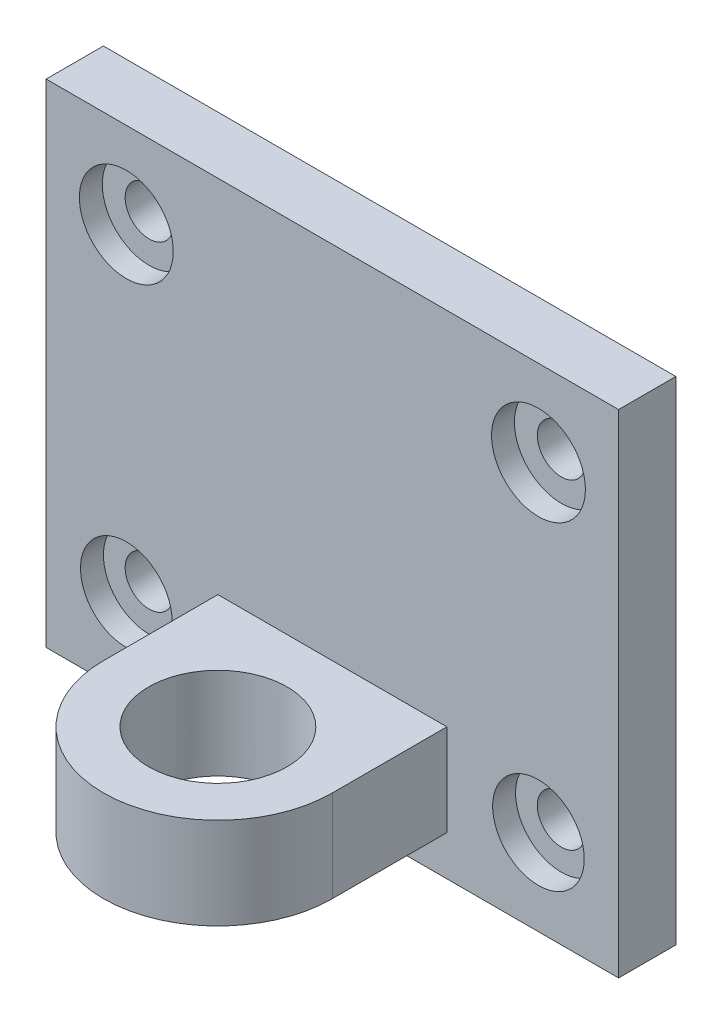
ISO-10303-21;
HEADER;
FILE_DESCRIPTION(('STEP AP214'),'2;1');
FILE_NAME('part.step','',(''),(''),'','','');
FILE_SCHEMA(('AUTOMOTIVE_DESIGN { 1 0 10303 214 1 1 1 1 }'));
ENDSEC;
DATA;
#1=APPLICATION_CONTEXT('core data for automotive mechanical design processes');
#2=APPLICATION_PROTOCOL_DEFINITION('international standard','automotive_design',2000,#1);
#3=PRODUCT_CONTEXT('',#1,'mechanical');
#4=PRODUCT('Part','Part','',(#3));
#5=PRODUCT_RELATED_PRODUCT_CATEGORY('part','',(#4));
#6=PRODUCT_DEFINITION_FORMATION('','',#4);
#7=PRODUCT_DEFINITION_CONTEXT('part definition',#1,'design');
#8=PRODUCT_DEFINITION('design','',#6,#7);
#9=PRODUCT_DEFINITION_SHAPE('','',#8);
#10=(LENGTH_UNIT() NAMED_UNIT(*) SI_UNIT(.MILLI.,.METRE.));
#11=(NAMED_UNIT(*) PLANE_ANGLE_UNIT() SI_UNIT($,.RADIAN.));
#12=(NAMED_UNIT(*) SI_UNIT($,.STERADIAN.) SOLID_ANGLE_UNIT());
#13=UNCERTAINTY_MEASURE_WITH_UNIT(LENGTH_MEASURE(1.E-05),#10,'distance_accuracy_value','');
#14=(GEOMETRIC_REPRESENTATION_CONTEXT(3) GLOBAL_UNCERTAINTY_ASSIGNED_CONTEXT((#13)) GLOBAL_UNIT_ASSIGNED_CONTEXT((#10,
#11,#12)) REPRESENTATION_CONTEXT('',''));
#15=CARTESIAN_POINT('',(0.,0.,0.));
#16=DIRECTION('',(0.,0.,1.));
#17=DIRECTION('',(1.,0.,0.));
#18=AXIS2_PLACEMENT_3D('',#15,#16,#17);
#19=CARTESIAN_POINT('',(-10.,26.5,12.));
#20=DIRECTION('',(0.,1.,0.));
#21=DIRECTION('',(0.,0.,1.));
#22=AXIS2_PLACEMENT_3D('',#19,#20,#21);
#23=PLANE('',#22);
#24=CARTESIAN_POINT('',(0.,26.5,2.00000000000001));
#25=DIRECTION('',(0.,1.,0.));
#26=DIRECTION('',(0.,0.,1.));
#27=AXIS2_PLACEMENT_3D('',#24,#25,#26);
#28=CIRCLE('',#27,6.05);
#29=CARTESIAN_POINT('',(0.,26.5,8.05));
#30=VERTEX_POINT('',#29);
#31=EDGE_CURVE('E347',#30,#30,#28,.T.);
#32=ORIENTED_EDGE('',*,*,#31,.F.);
#33=EDGE_LOOP('',(#32));
#34=FACE_BOUND('',#33,.T.);
#35=CARTESIAN_POINT('',(0.,26.5,2.00000000000001));
#36=DIRECTION('',(0.,1.,0.));
#37=DIRECTION('',(0.,0.,1.));
#38=AXIS2_PLACEMENT_3D('',#35,#36,#37);
#39=CIRCLE('',#38,10.);
#40=CARTESIAN_POINT('',(-10.,26.5,2.));
#41=VERTEX_POINT('',#40);
#42=CARTESIAN_POINT('',(10.,26.5,2.00000000000001));
#43=VERTEX_POINT('',#42);
#44=EDGE_CURVE('E245',#41,#43,#39,.T.);
#45=ORIENTED_EDGE('',*,*,#44,.T.);
#46=DIRECTION('',(0.,0.,-1.));
#47=VECTOR('',#46,1.);
#48=CARTESIAN_POINT('',(10.,26.5,12.));
#49=LINE('',#48,#47);
#50=CARTESIAN_POINT('',(10.,26.5,-8.));
#51=VERTEX_POINT('',#50);
#52=EDGE_CURVE('E248',#43,#51,#49,.T.);
#53=ORIENTED_EDGE('',*,*,#52,.T.);
#54=DIRECTION('',(1.,0.,0.));
#55=VECTOR('',#54,1.);
#56=CARTESIAN_POINT('',(-10.,26.5,-8.));
#57=LINE('',#56,#55);
#58=CARTESIAN_POINT('',(-10.,26.5,-8.));
#59=VERTEX_POINT('',#58);
#60=EDGE_CURVE('E342',#59,#51,#57,.T.);
#61=ORIENTED_EDGE('',*,*,#60,.F.);
#62=DIRECTION('',(0.,0.,-1.));
#63=VECTOR('',#62,1.);
#64=CARTESIAN_POINT('',(-10.,26.5,12.));
#65=LINE('',#64,#63);
#66=EDGE_CURVE('E249',#41,#59,#65,.T.);
#67=ORIENTED_EDGE('',*,*,#66,.F.);
#68=EDGE_LOOP('',(#45,#53,#61,#67));
#69=FACE_BOUND('',#68,.T.);
#70=ADVANCED_FACE('F179',(#34,#69),#23,.T.);
#71=CARTESIAN_POINT('',(10.,18.5,12.));
#72=DIRECTION('',(0.,-1.,0.));
#73=DIRECTION('',(0.,0.,-1.));
#74=AXIS2_PLACEMENT_3D('',#71,#72,#73);
#75=PLANE('',#74);
#76=CARTESIAN_POINT('',(0.,18.5,2.00000000000001));
#77=DIRECTION('',(0.,-1.,0.));
#78=DIRECTION('',(0.,0.,-1.));
#79=AXIS2_PLACEMENT_3D('',#76,#77,#78);
#80=CIRCLE('',#79,6.05);
#81=CARTESIAN_POINT('',(0.,18.5,-4.04999999999999));
#82=VERTEX_POINT('',#81);
#83=EDGE_CURVE('E340',#82,#82,#80,.T.);
#84=ORIENTED_EDGE('',*,*,#83,.F.);
#85=EDGE_LOOP('',(#84));
#86=FACE_BOUND('',#85,.T.);
#87=DIRECTION('',(0.,0.,-1.));
#88=VECTOR('',#87,1.);
#89=CARTESIAN_POINT('',(10.,18.5,12.));
#90=LINE('',#89,#88);
#91=CARTESIAN_POINT('',(10.,18.5,2.00000000000001));
#92=VERTEX_POINT('',#91);
#93=CARTESIAN_POINT('',(10.,18.5,-8.));
#94=VERTEX_POINT('',#93);
#95=EDGE_CURVE('E194',#92,#94,#90,.T.);
#96=ORIENTED_EDGE('',*,*,#95,.F.);
#97=CARTESIAN_POINT('',(0.,18.5,2.00000000000001));
#98=DIRECTION('',(0.,-1.,0.));
#99=DIRECTION('',(0.,0.,-1.));
#100=AXIS2_PLACEMENT_3D('',#97,#98,#99);
#101=CIRCLE('',#100,10.);
#102=CARTESIAN_POINT('',(-10.,18.5,2.));
#103=VERTEX_POINT('',#102);
#104=EDGE_CURVE('E256',#92,#103,#101,.T.);
#105=ORIENTED_EDGE('',*,*,#104,.T.);
#106=DIRECTION('',(0.,0.,-1.));
#107=VECTOR('',#106,1.);
#108=CARTESIAN_POINT('',(-10.,18.5,12.));
#109=LINE('',#108,#107);
#110=CARTESIAN_POINT('',(-10.,18.5,-8.));
#111=VERTEX_POINT('',#110);
#112=EDGE_CURVE('E264',#103,#111,#109,.T.);
#113=ORIENTED_EDGE('',*,*,#112,.T.);
#114=DIRECTION('',(-1.,0.,0.));
#115=VECTOR('',#114,1.);
#116=CARTESIAN_POINT('',(10.,18.5,-8.));
#117=LINE('',#116,#115);
#118=EDGE_CURVE('E357',#94,#111,#117,.T.);
#119=ORIENTED_EDGE('',*,*,#118,.F.);
#120=EDGE_LOOP('',(#96,#105,#113,#119));
#121=FACE_BOUND('',#120,.T.);
#122=ADVANCED_FACE('F361',(#86,#121),#75,.T.);
#123=CARTESIAN_POINT('',(0.,58.,-18.));
#124=DIRECTION('',(0.,-1.,0.));
#125=DIRECTION('',(0.,0.,-1.));
#126=AXIS2_PLACEMENT_3D('',#123,#124,#125);
#127=PLANE('',#126);
#128=DIRECTION('',(0.,0.,1.));
#129=VECTOR('',#128,1.);
#130=CARTESIAN_POINT('',(25.,58.,-18.));
#131=LINE('',#130,#129);
#132=CARTESIAN_POINT('',(25.,58.,-13.));
#133=VERTEX_POINT('',#132);
#134=CARTESIAN_POINT('',(25.,58.,-8.));
#135=VERTEX_POINT('',#134);
#136=EDGE_CURVE('E320',#133,#135,#131,.T.);
#137=ORIENTED_EDGE('',*,*,#136,.F.);
#138=DIRECTION('',(-1.,0.,0.));
#139=VECTOR('',#138,1.);
#140=CARTESIAN_POINT('',(25.,58.,-13.));
#141=LINE('',#140,#139);
#142=CARTESIAN_POINT('',(-25.,58.,-13.));
#143=VERTEX_POINT('',#142);
#144=EDGE_CURVE('E270',#133,#143,#141,.T.);
#145=ORIENTED_EDGE('',*,*,#144,.T.);
#146=DIRECTION('',(0.,0.,1.));
#147=VECTOR('',#146,1.);
#148=CARTESIAN_POINT('',(-25.,58.,-18.));
#149=LINE('',#148,#147);
#150=CARTESIAN_POINT('',(-25.,58.,-8.));
#151=VERTEX_POINT('',#150);
#152=EDGE_CURVE('E322',#143,#151,#149,.T.);
#153=ORIENTED_EDGE('',*,*,#152,.T.);
#154=DIRECTION('',(-1.,0.,0.));
#155=VECTOR('',#154,1.);
#156=CARTESIAN_POINT('',(-25.,58.,-8.));
#157=LINE('',#156,#155);
#158=EDGE_CURVE('E317',#135,#151,#157,.T.);
#159=ORIENTED_EDGE('',*,*,#158,.F.);
#160=EDGE_LOOP('',(#137,#145,#153,#159));
#161=FACE_BOUND('',#160,.T.);
#162=ADVANCED_FACE('F407',(#161),#127,.F.);
#163=CARTESIAN_POINT('',(-18.,50.5,-10.));
#164=DIRECTION('',(0.,0.,1.));
#165=DIRECTION('',(1.,0.,0.));
#166=AXIS2_PLACEMENT_3D('',#163,#164,#165);
#167=CYLINDRICAL_SURFACE('',#166,4.1);
#168=CARTESIAN_POINT('',(-18.,50.5,-10.));
#169=DIRECTION('',(0.,0.,1.));
#170=DIRECTION('',(1.,0.,0.));
#171=AXIS2_PLACEMENT_3D('',#168,#169,#170);
#172=CIRCLE('',#171,4.1);
#173=CARTESIAN_POINT('',(-13.9,50.5,-10.));
#174=VERTEX_POINT('',#173);
#175=EDGE_CURVE('E299',#174,#174,#172,.T.);
#176=CARTESIAN_POINT('',(-18.,50.5,-8.));
#177=DIRECTION('',(0.,0.,-1.));
#178=DIRECTION('',(-1.,0.,0.));
#179=AXIS2_PLACEMENT_3D('',#176,#177,#178);
#180=CIRCLE('',#179,4.1);
#181=CARTESIAN_POINT('',(-13.9,50.5,-7.99999999999999));
#182=VERTEX_POINT('',#181);
#183=EDGE_CURVE('E187',#182,#182,#180,.T.);
#184=CARTESIAN_POINT('',(-13.9,50.5,-10.));
#185=CARTESIAN_POINT('',(-13.9,50.5,-9.97916666666667));
#186=CARTESIAN_POINT('',(-13.9,50.5,-9.95833333333333));
#187=CARTESIAN_POINT('',(-13.9,50.5,-9.91666666666667));
#188=CARTESIAN_POINT('',(-13.9,50.5,-9.89583333333333));
#189=CARTESIAN_POINT('',(-13.9,50.5,-9.85416666666667));
#190=CARTESIAN_POINT('',(-13.9,50.5,-9.83333333333333));
#191=CARTESIAN_POINT('',(-13.9,50.5,-9.79166666666667));
#192=CARTESIAN_POINT('',(-13.9,50.5,-9.77083333333333));
#193=CARTESIAN_POINT('',(-13.9,50.5,-9.72916666666667));
#194=CARTESIAN_POINT('',(-13.9,50.5,-9.70833333333333));
#195=CARTESIAN_POINT('',(-13.9,50.5,-9.66666666666667));
#196=CARTESIAN_POINT('',(-13.9,50.5,-9.64583333333333));
#197=CARTESIAN_POINT('',(-13.9,50.5,-9.60416666666667));
#198=CARTESIAN_POINT('',(-13.9,50.5,-9.58333333333333));
#199=CARTESIAN_POINT('',(-13.9,50.5,-9.54166666666667));
#200=CARTESIAN_POINT('',(-13.9,50.5,-9.52083333333333));
#201=CARTESIAN_POINT('',(-13.9,50.5,-9.47916666666667));
#202=CARTESIAN_POINT('',(-13.9,50.5,-9.45833333333333));
#203=CARTESIAN_POINT('',(-13.9,50.5,-9.41666666666667));
#204=CARTESIAN_POINT('',(-13.9,50.5,-9.39583333333333));
#205=CARTESIAN_POINT('',(-13.9,50.5,-9.35416666666666));
#206=CARTESIAN_POINT('',(-13.9,50.5,-9.33333333333333));
#207=CARTESIAN_POINT('',(-13.9,50.5,-9.29166666666666));
#208=CARTESIAN_POINT('',(-13.9,50.5,-9.27083333333333));
#209=CARTESIAN_POINT('',(-13.9,50.5,-9.22916666666666));
#210=CARTESIAN_POINT('',(-13.9,50.5,-9.20833333333333));
#211=CARTESIAN_POINT('',(-13.9,50.5,-9.16666666666666));
#212=CARTESIAN_POINT('',(-13.9,50.5,-9.14583333333333));
#213=CARTESIAN_POINT('',(-13.9,50.5,-9.10416666666666));
#214=CARTESIAN_POINT('',(-13.9,50.5,-9.08333333333333));
#215=CARTESIAN_POINT('',(-13.9,50.5,-9.04166666666666));
#216=CARTESIAN_POINT('',(-13.9,50.5,-9.02083333333333));
#217=CARTESIAN_POINT('',(-13.9,50.5,-8.97916666666666));
#218=CARTESIAN_POINT('',(-13.9,50.5,-8.95833333333333));
#219=CARTESIAN_POINT('',(-13.9,50.5,-8.91666666666666));
#220=CARTESIAN_POINT('',(-13.9,50.5,-8.89583333333333));
#221=CARTESIAN_POINT('',(-13.9,50.5,-8.85416666666666));
#222=CARTESIAN_POINT('',(-13.9,50.5,-8.83333333333333));
#223=CARTESIAN_POINT('',(-13.9,50.5,-8.79166666666666));
#224=CARTESIAN_POINT('',(-13.9,50.5,-8.77083333333333));
#225=CARTESIAN_POINT('',(-13.9,50.5,-8.72916666666666));
#226=CARTESIAN_POINT('',(-13.9,50.5,-8.70833333333333));
#227=CARTESIAN_POINT('',(-13.9,50.5,-8.66666666666666));
#228=CARTESIAN_POINT('',(-13.9,50.5,-8.64583333333333));
#229=CARTESIAN_POINT('',(-13.9,50.5,-8.60416666666666));
#230=CARTESIAN_POINT('',(-13.9,50.5,-8.58333333333333));
#231=CARTESIAN_POINT('',(-13.9,50.5,-8.54166666666666));
#232=CARTESIAN_POINT('',(-13.9,50.5,-8.52083333333333));
#233=CARTESIAN_POINT('',(-13.9,50.5,-8.47916666666666));
#234=CARTESIAN_POINT('',(-13.9,50.5,-8.45833333333333));
#235=CARTESIAN_POINT('',(-13.9,50.5,-8.41666666666666));
#236=CARTESIAN_POINT('',(-13.9,50.5,-8.39583333333333));
#237=CARTESIAN_POINT('',(-13.9,50.5,-8.35416666666666));
#238=CARTESIAN_POINT('',(-13.9,50.5,-8.33333333333333));
#239=CARTESIAN_POINT('',(-13.9,50.5,-8.29166666666666));
#240=CARTESIAN_POINT('',(-13.9,50.5,-8.27083333333333));
#241=CARTESIAN_POINT('',(-13.9,50.5,-8.22916666666666));
#242=CARTESIAN_POINT('',(-13.9,50.5,-8.20833333333333));
#243=CARTESIAN_POINT('',(-13.9,50.5,-8.16666666666666));
#244=CARTESIAN_POINT('',(-13.9,50.5,-8.14583333333333));
#245=CARTESIAN_POINT('',(-13.9,50.5,-8.10416666666666));
#246=CARTESIAN_POINT('',(-13.9,50.5,-8.08333333333333));
#247=CARTESIAN_POINT('',(-13.9,50.5,-8.04166666666666));
#248=CARTESIAN_POINT('',(-13.9,50.5,-8.02083333333333));
#249=CARTESIAN_POINT('',(-13.9,50.5,-7.99999999999999));
#250=B_SPLINE_CURVE_WITH_KNOTS('',3,(#184,#185,#186,#187,#188,#189,#190,#191,#192,#193,#194,
#195,#196,#197,#198,#199,#200,#201,#202,#203,#204,#205,#206,#207,#208,#209,#210,#211,#212,#213,
#214,#215,#216,#217,#218,#219,#220,#221,#222,#223,#224,#225,#226,#227,#228,#229,#230,#231,#232,
#233,#234,#235,#236,#237,#238,#239,#240,#241,#242,#243,#244,#245,#246,#247,#248,#249),
.UNSPECIFIED.,.F.,.F.,(4,2,2,2,2,2,2,2,2,2,2,2,2,2,2,2,2,2,2,2,2,2,2,2,2,2,2,2,2,2,2,2,4),(0.,
0.0625000000000001,0.125,0.1875,0.25,0.3125,0.375,0.4375,0.5,0.5625,0.625000000000001,
0.687500000000001,0.750000000000001,0.812500000000001,0.875000000000001,0.937500000000001,1.,
1.0625,1.125,1.1875,1.25,1.3125,1.375,1.4375,1.5,1.5625,1.625,1.6875,1.75,1.8125,1.875,1.9375,
2.),.UNSPECIFIED.);
#251=EDGE_CURVE('BSEAM493',#174,#182,#250,.T.);
#252=ORIENTED_EDGE('',*,*,#175,.F.);
#253=ORIENTED_EDGE('',*,*,#183,.F.);
#254=ORIENTED_EDGE('',*,*,#251,.T.);
#255=ORIENTED_EDGE('',*,*,#251,.F.);
#256=EDGE_LOOP('',(#252,#254,#253,#255));
#257=FACE_BOUND('',#256,.T.);
#258=ADVANCED_FACE('F493',(#257),#167,.F.);
#259=CARTESIAN_POINT('',(18.,50.5,-10.));
#260=DIRECTION('',(0.,0.,1.));
#261=DIRECTION('',(1.,0.,0.));
#262=AXIS2_PLACEMENT_3D('',#259,#260,#261);
#263=CYLINDRICAL_SURFACE('',#262,4.1);
#264=CARTESIAN_POINT('',(18.,50.5,-10.));
#265=DIRECTION('',(0.,0.,1.));
#266=DIRECTION('',(1.,0.,0.));
#267=AXIS2_PLACEMENT_3D('',#264,#265,#266);
#268=CIRCLE('',#267,4.1);
#269=CARTESIAN_POINT('',(22.1,50.5,-10.));
#270=VERTEX_POINT('',#269);
#271=EDGE_CURVE('E303',#270,#270,#268,.T.);
#272=CARTESIAN_POINT('',(18.,50.5,-8.));
#273=DIRECTION('',(0.,0.,-1.));
#274=DIRECTION('',(-1.,0.,0.));
#275=AXIS2_PLACEMENT_3D('',#272,#273,#274);
#276=CIRCLE('',#275,4.1);
#277=CARTESIAN_POINT('',(22.1,50.5,-7.99999999999999));
#278=VERTEX_POINT('',#277);
#279=EDGE_CURVE('E328',#278,#278,#276,.T.);
#280=CARTESIAN_POINT('',(22.1,50.5,-10.));
#281=CARTESIAN_POINT('',(22.1,50.5,-9.97916666666667));
#282=CARTESIAN_POINT('',(22.1,50.5,-9.95833333333333));
#283=CARTESIAN_POINT('',(22.1,50.5,-9.91666666666667));
#284=CARTESIAN_POINT('',(22.1,50.5,-9.89583333333333));
#285=CARTESIAN_POINT('',(22.1,50.5,-9.85416666666667));
#286=CARTESIAN_POINT('',(22.1,50.5,-9.83333333333333));
#287=CARTESIAN_POINT('',(22.1,50.5,-9.79166666666667));
#288=CARTESIAN_POINT('',(22.1,50.5,-9.77083333333333));
#289=CARTESIAN_POINT('',(22.1,50.5,-9.72916666666667));
#290=CARTESIAN_POINT('',(22.1,50.5,-9.70833333333333));
#291=CARTESIAN_POINT('',(22.1,50.5,-9.66666666666667));
#292=CARTESIAN_POINT('',(22.1,50.5,-9.64583333333333));
#293=CARTESIAN_POINT('',(22.1,50.5,-9.60416666666667));
#294=CARTESIAN_POINT('',(22.1,50.5,-9.58333333333333));
#295=CARTESIAN_POINT('',(22.1,50.5,-9.54166666666667));
#296=CARTESIAN_POINT('',(22.1,50.5,-9.52083333333333));
#297=CARTESIAN_POINT('',(22.1,50.5,-9.47916666666667));
#298=CARTESIAN_POINT('',(22.1,50.5,-9.45833333333333));
#299=CARTESIAN_POINT('',(22.1,50.5,-9.41666666666667));
#300=CARTESIAN_POINT('',(22.1,50.5,-9.39583333333333));
#301=CARTESIAN_POINT('',(22.1,50.5,-9.35416666666666));
#302=CARTESIAN_POINT('',(22.1,50.5,-9.33333333333333));
#303=CARTESIAN_POINT('',(22.1,50.5,-9.29166666666666));
#304=CARTESIAN_POINT('',(22.1,50.5,-9.27083333333333));
#305=CARTESIAN_POINT('',(22.1,50.5,-9.22916666666666));
#306=CARTESIAN_POINT('',(22.1,50.5,-9.20833333333333));
#307=CARTESIAN_POINT('',(22.1,50.5,-9.16666666666666));
#308=CARTESIAN_POINT('',(22.1,50.5,-9.14583333333333));
#309=CARTESIAN_POINT('',(22.1,50.5,-9.10416666666666));
#310=CARTESIAN_POINT('',(22.1,50.5,-9.08333333333333));
#311=CARTESIAN_POINT('',(22.1,50.5,-9.04166666666666));
#312=CARTESIAN_POINT('',(22.1,50.5,-9.02083333333333));
#313=CARTESIAN_POINT('',(22.1,50.5,-8.97916666666666));
#314=CARTESIAN_POINT('',(22.1,50.5,-8.95833333333333));
#315=CARTESIAN_POINT('',(22.1,50.5,-8.91666666666666));
#316=CARTESIAN_POINT('',(22.1,50.5,-8.89583333333333));
#317=CARTESIAN_POINT('',(22.1,50.5,-8.85416666666666));
#318=CARTESIAN_POINT('',(22.1,50.5,-8.83333333333333));
#319=CARTESIAN_POINT('',(22.1,50.5,-8.79166666666666));
#320=CARTESIAN_POINT('',(22.1,50.5,-8.77083333333333));
#321=CARTESIAN_POINT('',(22.1,50.5,-8.72916666666666));
#322=CARTESIAN_POINT('',(22.1,50.5,-8.70833333333333));
#323=CARTESIAN_POINT('',(22.1,50.5,-8.66666666666666));
#324=CARTESIAN_POINT('',(22.1,50.5,-8.64583333333333));
#325=CARTESIAN_POINT('',(22.1,50.5,-8.60416666666666));
#326=CARTESIAN_POINT('',(22.1,50.5,-8.58333333333333));
#327=CARTESIAN_POINT('',(22.1,50.5,-8.54166666666666));
#328=CARTESIAN_POINT('',(22.1,50.5,-8.52083333333333));
#329=CARTESIAN_POINT('',(22.1,50.5,-8.47916666666666));
#330=CARTESIAN_POINT('',(22.1,50.5,-8.45833333333333));
#331=CARTESIAN_POINT('',(22.1,50.5,-8.41666666666666));
#332=CARTESIAN_POINT('',(22.1,50.5,-8.39583333333333));
#333=CARTESIAN_POINT('',(22.1,50.5,-8.35416666666666));
#334=CARTESIAN_POINT('',(22.1,50.5,-8.33333333333333));
#335=CARTESIAN_POINT('',(22.1,50.5,-8.29166666666666));
#336=CARTESIAN_POINT('',(22.1,50.5,-8.27083333333333));
#337=CARTESIAN_POINT('',(22.1,50.5,-8.22916666666666));
#338=CARTESIAN_POINT('',(22.1,50.5,-8.20833333333333));
#339=CARTESIAN_POINT('',(22.1,50.5,-8.16666666666666));
#340=CARTESIAN_POINT('',(22.1,50.5,-8.14583333333333));
#341=CARTESIAN_POINT('',(22.1,50.5,-8.10416666666666));
#342=CARTESIAN_POINT('',(22.1,50.5,-8.08333333333333));
#343=CARTESIAN_POINT('',(22.1,50.5,-8.04166666666666));
#344=CARTESIAN_POINT('',(22.1,50.5,-8.02083333333333));
#345=CARTESIAN_POINT('',(22.1,50.5,-7.99999999999999));
#346=B_SPLINE_CURVE_WITH_KNOTS('',3,(#280,#281,#282,#283,#284,#285,#286,#287,#288,#289,#290,
#291,#292,#293,#294,#295,#296,#297,#298,#299,#300,#301,#302,#303,#304,#305,#306,#307,#308,#309,
#310,#311,#312,#313,#314,#315,#316,#317,#318,#319,#320,#321,#322,#323,#324,#325,#326,#327,#328,
#329,#330,#331,#332,#333,#334,#335,#336,#337,#338,#339,#340,#341,#342,#343,#344,#345),
.UNSPECIFIED.,.F.,.F.,(4,2,2,2,2,2,2,2,2,2,2,2,2,2,2,2,2,2,2,2,2,2,2,2,2,2,2,2,2,2,2,2,4),(0.,
0.0625000000000001,0.125,0.1875,0.25,0.3125,0.375,0.4375,0.5,0.5625,0.625000000000001,
0.687500000000001,0.750000000000001,0.812500000000001,0.875000000000001,0.937500000000001,1.,
1.0625,1.125,1.1875,1.25,1.3125,1.375,1.4375,1.5,1.5625,1.625,1.6875,1.75,1.8125,1.875,1.9375,
2.),.UNSPECIFIED.);
#347=EDGE_CURVE('BSEAM483',#270,#278,#346,.T.);
#348=ORIENTED_EDGE('',*,*,#271,.F.);
#349=ORIENTED_EDGE('',*,*,#279,.F.);
#350=ORIENTED_EDGE('',*,*,#347,.T.);
#351=ORIENTED_EDGE('',*,*,#347,.F.);
#352=EDGE_LOOP('',(#348,#350,#349,#351));
#353=FACE_BOUND('',#352,.T.);
#354=ADVANCED_FACE('F483',(#353),#263,.F.);
#355=CARTESIAN_POINT('',(25.,58.,-18.));
#356=DIRECTION('',(-1.,0.,0.));
#357=DIRECTION('',(0.,-1.,0.));
#358=AXIS2_PLACEMENT_3D('',#355,#356,#357);
#359=PLANE('',#358);
#360=DIRECTION('',(0.,0.,1.));
#361=VECTOR('',#360,1.);
#362=CARTESIAN_POINT('',(25.,15.,-18.));
#363=LINE('',#362,#361);
#364=CARTESIAN_POINT('',(25.,15.,-13.));
#365=VERTEX_POINT('',#364);
#366=CARTESIAN_POINT('',(25.,15.,-8.));
#367=VERTEX_POINT('',#366);
#368=EDGE_CURVE('E326',#365,#367,#363,.T.);
#369=ORIENTED_EDGE('',*,*,#368,.F.);
#370=DIRECTION('',(0.,1.,0.));
#371=VECTOR('',#370,1.);
#372=CARTESIAN_POINT('',(25.,58.,-13.));
#373=LINE('',#372,#371);
#374=EDGE_CURVE('E202',#365,#133,#373,.T.);
#375=ORIENTED_EDGE('',*,*,#374,.T.);
#376=ORIENTED_EDGE('',*,*,#136,.T.);
#377=DIRECTION('',(0.,1.,0.));
#378=VECTOR('',#377,1.);
#379=CARTESIAN_POINT('',(25.,58.,-8.));
#380=LINE('',#379,#378);
#381=EDGE_CURVE('E314',#367,#135,#380,.T.);
#382=ORIENTED_EDGE('',*,*,#381,.F.);
#383=EDGE_LOOP('',(#369,#375,#376,#382));
#384=FACE_BOUND('',#383,.T.);
#385=ADVANCED_FACE('F475',(#384),#359,.F.);
#386=CARTESIAN_POINT('',(-25.,58.,-18.));
#387=DIRECTION('',(-1.,0.,0.));
#388=DIRECTION('',(0.,0.,1.));
#389=AXIS2_PLACEMENT_3D('',#386,#387,#388);
#390=PLANE('',#389);
#391=DIRECTION('',(0.,1.,0.));
#392=VECTOR('',#391,1.);
#393=CARTESIAN_POINT('',(-25.,58.,-13.));
#394=LINE('',#393,#392);
#395=CARTESIAN_POINT('',(-25.,15.,-13.));
#396=VERTEX_POINT('',#395);
#397=EDGE_CURVE('E261',#396,#143,#394,.T.);
#398=ORIENTED_EDGE('',*,*,#397,.F.);
#399=DIRECTION('',(0.,0.,1.));
#400=VECTOR('',#399,1.);
#401=CARTESIAN_POINT('',(-25.,15.,-18.));
#402=LINE('',#401,#400);
#403=CARTESIAN_POINT('',(-25.,15.,-8.));
#404=VERTEX_POINT('',#403);
#405=EDGE_CURVE('E324',#396,#404,#402,.T.);
#406=ORIENTED_EDGE('',*,*,#405,.T.);
#407=DIRECTION('',(0.,-1.,0.));
#408=VECTOR('',#407,1.);
#409=CARTESIAN_POINT('',(-25.,15.,-8.));
#410=LINE('',#409,#408);
#411=EDGE_CURVE('E307',#151,#404,#410,.T.);
#412=ORIENTED_EDGE('',*,*,#411,.F.);
#413=ORIENTED_EDGE('',*,*,#152,.F.);
#414=EDGE_LOOP('',(#398,#406,#412,#413));
#415=FACE_BOUND('',#414,.T.);
#416=ADVANCED_FACE('F470',(#415),#390,.T.);
#417=CARTESIAN_POINT('',(-18.,22.5,82.));
#418=DIRECTION('',(0.,0.,-1.));
#419=DIRECTION('',(-1.,0.,0.));
#420=AXIS2_PLACEMENT_3D('',#417,#418,#419);
#421=CYLINDRICAL_SURFACE('',#420,2.1);
#422=CARTESIAN_POINT('',(-18.,22.5,-13.));
#423=DIRECTION('',(0.,0.,1.));
#424=DIRECTION('',(0.,-1.,0.));
#425=AXIS2_PLACEMENT_3D('',#422,#423,#424);
#426=CIRCLE('',#425,2.1);
#427=CARTESIAN_POINT('',(-18.,20.4,-13.));
#428=VERTEX_POINT('',#427);
#429=EDGE_CURVE('E283',#428,#428,#426,.F.);
#430=ORIENTED_EDGE('',*,*,#429,.T.);
#431=EDGE_LOOP('',(#430));
#432=FACE_BOUND('',#431,.T.);
#433=CARTESIAN_POINT('',(-18.,22.5,-9.99999999999999));
#434=DIRECTION('',(0.,0.,1.));
#435=DIRECTION('',(1.,0.,0.));
#436=AXIS2_PLACEMENT_3D('',#433,#434,#435);
#437=CIRCLE('',#436,2.1);
#438=CARTESIAN_POINT('',(-15.9,22.5,-9.99999999999999));
#439=VERTEX_POINT('',#438);
#440=EDGE_CURVE('E306',#439,#439,#437,.F.);
#441=ORIENTED_EDGE('',*,*,#440,.F.);
#442=EDGE_LOOP('',(#441));
#443=FACE_BOUND('',#442,.T.);
#444=ADVANCED_FACE('F474',(#432,#443),#421,.F.);
#445=CARTESIAN_POINT('',(18.,22.5,82.));
#446=DIRECTION('',(0.,0.,-1.));
#447=DIRECTION('',(-1.,0.,0.));
#448=AXIS2_PLACEMENT_3D('',#445,#446,#447);
#449=CYLINDRICAL_SURFACE('',#448,2.1);
#450=CARTESIAN_POINT('',(18.,22.5,-13.));
#451=DIRECTION('',(0.,0.,1.));
#452=DIRECTION('',(0.,-1.,0.));
#453=AXIS2_PLACEMENT_3D('',#450,#451,#452);
#454=CIRCLE('',#453,2.1);
#455=CARTESIAN_POINT('',(18.,20.4,-13.));
#456=VERTEX_POINT('',#455);
#457=EDGE_CURVE('E280',#456,#456,#454,.F.);
#458=ORIENTED_EDGE('',*,*,#457,.T.);
#459=EDGE_LOOP('',(#458));
#460=FACE_BOUND('',#459,.T.);
#461=CARTESIAN_POINT('',(18.,22.5,-9.99999999999999));
#462=DIRECTION('',(0.,0.,1.));
#463=DIRECTION('',(1.,0.,0.));
#464=AXIS2_PLACEMENT_3D('',#461,#462,#463);
#465=CIRCLE('',#464,2.1);
#466=CARTESIAN_POINT('',(20.1,22.5,-9.99999999999999));
#467=VERTEX_POINT('',#466);
#468=EDGE_CURVE('E290',#467,#467,#465,.F.);
#469=ORIENTED_EDGE('',*,*,#468,.F.);
#470=EDGE_LOOP('',(#469));
#471=FACE_BOUND('',#470,.T.);
#472=ADVANCED_FACE('F369',(#460,#471),#449,.F.);
#473=CARTESIAN_POINT('',(-20.,51.5,-8.));
#474=DIRECTION('',(0.,0.,-1.));
#475=DIRECTION('',(-1.,0.,0.));
#476=AXIS2_PLACEMENT_3D('',#473,#474,#475);
#477=PLANE('',#476);
#478=DIRECTION('',(0.,-1.,0.));
#479=VECTOR('',#478,1.);
#480=CARTESIAN_POINT('',(-10.,22.5,-8.));
#481=LINE('',#480,#479);
#482=EDGE_CURVE('E345',#59,#111,#481,.T.);
#483=ORIENTED_EDGE('',*,*,#482,.F.);
#484=ORIENTED_EDGE('',*,*,#60,.T.);
#485=DIRECTION('',(0.,-1.,0.));
#486=VECTOR('',#485,1.);
#487=CARTESIAN_POINT('',(10.,22.5,-8.));
#488=LINE('',#487,#486);
#489=EDGE_CURVE('E259',#51,#94,#488,.T.);
#490=ORIENTED_EDGE('',*,*,#489,.T.);
#491=ORIENTED_EDGE('',*,*,#118,.T.);
#492=EDGE_LOOP('',(#483,#484,#490,#491));
#493=FACE_BOUND('',#492,.T.);
#494=ORIENTED_EDGE('',*,*,#183,.T.);
#495=EDGE_LOOP('',(#494));
#496=FACE_BOUND('',#495,.T.);
#497=ORIENTED_EDGE('',*,*,#279,.T.);
#498=EDGE_LOOP('',(#497));
#499=FACE_BOUND('',#498,.T.);
#500=ORIENTED_EDGE('',*,*,#381,.T.);
#501=ORIENTED_EDGE('',*,*,#158,.T.);
#502=ORIENTED_EDGE('',*,*,#411,.T.);
#503=DIRECTION('',(1.,0.,0.));
#504=VECTOR('',#503,1.);
#505=CARTESIAN_POINT('',(25.,15.,-8.));
#506=LINE('',#505,#504);
#507=EDGE_CURVE('E310',#404,#367,#506,.T.);
#508=ORIENTED_EDGE('',*,*,#507,.T.);
#509=EDGE_LOOP('',(#500,#501,#502,#508));
#510=FACE_BOUND('',#509,.T.);
#511=CARTESIAN_POINT('',(18.,22.5,-8.));
#512=DIRECTION('',(0.,0.,1.));
#513=DIRECTION('',(1.,0.,0.));
#514=AXIS2_PLACEMENT_3D('',#511,#512,#513);
#515=CIRCLE('',#514,4.);
#516=CARTESIAN_POINT('',(22.,22.5,-8.));
#517=VERTEX_POINT('',#516);
#518=EDGE_CURVE('E286',#517,#517,#515,.T.);
#519=ORIENTED_EDGE('',*,*,#518,.F.);
#520=EDGE_LOOP('',(#519));
#521=FACE_BOUND('',#520,.T.);
#522=CARTESIAN_POINT('',(-18.,22.5,-8.));
#523=DIRECTION('',(0.,0.,1.));
#524=DIRECTION('',(1.,0.,0.));
#525=AXIS2_PLACEMENT_3D('',#522,#523,#524);
#526=CIRCLE('',#525,4.);
#527=CARTESIAN_POINT('',(-14.,22.5,-8.));
#528=VERTEX_POINT('',#527);
#529=EDGE_CURVE('E291',#528,#528,#526,.T.);
#530=ORIENTED_EDGE('',*,*,#529,.F.);
#531=EDGE_LOOP('',(#530));
#532=FACE_BOUND('',#531,.T.);
#533=ADVANCED_FACE('F181',(#493,#496,#499,#510,#521,#532),#477,.F.);
#534=CARTESIAN_POINT('',(18.,50.5,82.));
#535=DIRECTION('',(0.,0.,-1.));
#536=DIRECTION('',(-1.,0.,0.));
#537=AXIS2_PLACEMENT_3D('',#534,#535,#536);
#538=CYLINDRICAL_SURFACE('',#537,2.1);
#539=CARTESIAN_POINT('',(18.,50.5,-13.));
#540=DIRECTION('',(0.,0.,1.));
#541=DIRECTION('',(0.,-1.,0.));
#542=AXIS2_PLACEMENT_3D('',#539,#540,#541);
#543=CIRCLE('',#542,2.1);
#544=CARTESIAN_POINT('',(18.,48.4,-13.));
#545=VERTEX_POINT('',#544);
#546=EDGE_CURVE('E277',#545,#545,#543,.F.);
#547=ORIENTED_EDGE('',*,*,#546,.T.);
#548=EDGE_LOOP('',(#547));
#549=FACE_BOUND('',#548,.T.);
#550=CARTESIAN_POINT('',(18.,50.5,-9.99999999999999));
#551=DIRECTION('',(0.,0.,1.));
#552=DIRECTION('',(1.,0.,0.));
#553=AXIS2_PLACEMENT_3D('',#550,#551,#552);
#554=CIRCLE('',#553,2.1);
#555=CARTESIAN_POINT('',(20.1,50.5,-9.99999999999999));
#556=VERTEX_POINT('',#555);
#557=EDGE_CURVE('E311',#556,#556,#554,.F.);
#558=ORIENTED_EDGE('',*,*,#557,.F.);
#559=EDGE_LOOP('',(#558));
#560=FACE_BOUND('',#559,.T.);
#561=ADVANCED_FACE('F368',(#549,#560),#538,.F.);
#562=CARTESIAN_POINT('',(-18.,50.5,82.));
#563=DIRECTION('',(0.,0.,-1.));
#564=DIRECTION('',(-1.,0.,0.));
#565=AXIS2_PLACEMENT_3D('',#562,#563,#564);
#566=CYLINDRICAL_SURFACE('',#565,2.1);
#567=CARTESIAN_POINT('',(-18.,50.5,-13.));
#568=DIRECTION('',(0.,0.,1.));
#569=DIRECTION('',(0.,-1.,0.));
#570=AXIS2_PLACEMENT_3D('',#567,#568,#569);
#571=CIRCLE('',#570,2.1);
#572=CARTESIAN_POINT('',(-18.,48.4,-13.));
#573=VERTEX_POINT('',#572);
#574=EDGE_CURVE('E273',#573,#573,#571,.F.);
#575=ORIENTED_EDGE('',*,*,#574,.T.);
#576=EDGE_LOOP('',(#575));
#577=FACE_BOUND('',#576,.T.);
#578=CARTESIAN_POINT('',(-18.,50.5,-9.99999999999999));
#579=DIRECTION('',(0.,0.,1.));
#580=DIRECTION('',(1.,0.,0.));
#581=AXIS2_PLACEMENT_3D('',#578,#579,#580);
#582=CIRCLE('',#581,2.1);
#583=CARTESIAN_POINT('',(-15.9,50.5,-9.99999999999999));
#584=VERTEX_POINT('',#583);
#585=EDGE_CURVE('E302',#584,#584,#582,.F.);
#586=ORIENTED_EDGE('',*,*,#585,.F.);
#587=EDGE_LOOP('',(#586));
#588=FACE_BOUND('',#587,.T.);
#589=ADVANCED_FACE('F569',(#577,#588),#566,.F.);
#590=CARTESIAN_POINT('',(25.,15.,-18.));
#591=DIRECTION('',(0.,1.,0.));
#592=DIRECTION('',(0.,0.,1.));
#593=AXIS2_PLACEMENT_3D('',#590,#591,#592);
#594=PLANE('',#593);
#595=ORIENTED_EDGE('',*,*,#405,.F.);
#596=DIRECTION('',(-1.,0.,0.));
#597=VECTOR('',#596,1.);
#598=CARTESIAN_POINT('',(25.,15.,-13.));
#599=LINE('',#598,#597);
#600=EDGE_CURVE('E268',#365,#396,#599,.T.);
#601=ORIENTED_EDGE('',*,*,#600,.F.);
#602=ORIENTED_EDGE('',*,*,#368,.T.);
#603=ORIENTED_EDGE('',*,*,#507,.F.);
#604=EDGE_LOOP('',(#595,#601,#602,#603));
#605=FACE_BOUND('',#604,.T.);
#606=ADVANCED_FACE('F561',(#605),#594,.F.);
#607=CARTESIAN_POINT('',(-18.,50.5,-10.));
#608=DIRECTION('',(0.,0.,1.));
#609=DIRECTION('',(1.,0.,0.));
#610=AXIS2_PLACEMENT_3D('',#607,#608,#609);
#611=PLANE('',#610);
#612=ORIENTED_EDGE('',*,*,#175,.T.);
#613=EDGE_LOOP('',(#612));
#614=FACE_BOUND('',#613,.T.);
#615=ORIENTED_EDGE('',*,*,#585,.T.);
#616=EDGE_LOOP('',(#615));
#617=FACE_BOUND('',#616,.T.);
#618=ADVANCED_FACE('F553',(#614,#617),#611,.T.);
#619=CARTESIAN_POINT('',(18.,50.5,-10.));
#620=DIRECTION('',(0.,0.,1.));
#621=DIRECTION('',(1.,0.,0.));
#622=AXIS2_PLACEMENT_3D('',#619,#620,#621);
#623=PLANE('',#622);
#624=ORIENTED_EDGE('',*,*,#271,.T.);
#625=EDGE_LOOP('',(#624));
#626=FACE_BOUND('',#625,.T.);
#627=ORIENTED_EDGE('',*,*,#557,.T.);
#628=EDGE_LOOP('',(#627));
#629=FACE_BOUND('',#628,.T.);
#630=ADVANCED_FACE('F547',(#626,#629),#623,.T.);
#631=CARTESIAN_POINT('',(18.,22.5,-10.));
#632=DIRECTION('',(0.,0.,1.));
#633=DIRECTION('',(1.,0.,0.));
#634=AXIS2_PLACEMENT_3D('',#631,#632,#633);
#635=PLANE('',#634);
#636=CARTESIAN_POINT('',(18.,22.5,-10.));
#637=DIRECTION('',(0.,0.,1.));
#638=DIRECTION('',(1.,0.,0.));
#639=AXIS2_PLACEMENT_3D('',#636,#637,#638);
#640=CIRCLE('',#639,4.);
#641=CARTESIAN_POINT('',(22.,22.5,-10.));
#642=VERTEX_POINT('',#641);
#643=EDGE_CURVE('E294',#642,#642,#640,.T.);
#644=ORIENTED_EDGE('',*,*,#643,.T.);
#645=EDGE_LOOP('',(#644));
#646=FACE_BOUND('',#645,.T.);
#647=ORIENTED_EDGE('',*,*,#468,.T.);
#648=EDGE_LOOP('',(#647));
#649=FACE_BOUND('',#648,.T.);
#650=ADVANCED_FACE('F538',(#646,#649),#635,.T.);
#651=CARTESIAN_POINT('',(18.,22.5,-10.));
#652=DIRECTION('',(0.,0.,1.));
#653=DIRECTION('',(1.,0.,0.));
#654=AXIS2_PLACEMENT_3D('',#651,#652,#653);
#655=CYLINDRICAL_SURFACE('',#654,4.);
#656=ORIENTED_EDGE('',*,*,#643,.F.);
#657=EDGE_LOOP('',(#656));
#658=FACE_BOUND('',#657,.T.);
#659=ORIENTED_EDGE('',*,*,#518,.T.);
#660=EDGE_LOOP('',(#659));
#661=FACE_BOUND('',#660,.T.);
#662=ADVANCED_FACE('F395',(#658,#661),#655,.F.);
#663=CARTESIAN_POINT('',(-18.,22.5,-10.));
#664=DIRECTION('',(0.,0.,1.));
#665=DIRECTION('',(1.,0.,0.));
#666=AXIS2_PLACEMENT_3D('',#663,#664,#665);
#667=PLANE('',#666);
#668=CARTESIAN_POINT('',(-18.,22.5,-10.));
#669=DIRECTION('',(0.,0.,1.));
#670=DIRECTION('',(1.,0.,0.));
#671=AXIS2_PLACEMENT_3D('',#668,#669,#670);
#672=CIRCLE('',#671,4.);
#673=CARTESIAN_POINT('',(-14.,22.5,-10.));
#674=VERTEX_POINT('',#673);
#675=EDGE_CURVE('E287',#674,#674,#672,.T.);
#676=ORIENTED_EDGE('',*,*,#675,.T.);
#677=EDGE_LOOP('',(#676));
#678=FACE_BOUND('',#677,.T.);
#679=ORIENTED_EDGE('',*,*,#440,.T.);
#680=EDGE_LOOP('',(#679));
#681=FACE_BOUND('',#680,.T.);
#682=ADVANCED_FACE('F384',(#678,#681),#667,.T.);
#683=CARTESIAN_POINT('',(-18.,22.5,-10.));
#684=DIRECTION('',(0.,0.,1.));
#685=DIRECTION('',(1.,0.,0.));
#686=AXIS2_PLACEMENT_3D('',#683,#684,#685);
#687=CYLINDRICAL_SURFACE('',#686,4.);
#688=ORIENTED_EDGE('',*,*,#675,.F.);
#689=EDGE_LOOP('',(#688));
#690=FACE_BOUND('',#689,.T.);
#691=ORIENTED_EDGE('',*,*,#529,.T.);
#692=EDGE_LOOP('',(#691));
#693=FACE_BOUND('',#692,.T.);
#694=ADVANCED_FACE('F381',(#690,#693),#687,.F.);
#695=CARTESIAN_POINT('',(25.,58.,-13.));
#696=DIRECTION('',(0.,0.,1.));
#697=DIRECTION('',(0.,-1.,0.));
#698=AXIS2_PLACEMENT_3D('',#695,#696,#697);
#699=PLANE('',#698);
#700=ORIENTED_EDGE('',*,*,#457,.F.);
#701=EDGE_LOOP('',(#700));
#702=FACE_BOUND('',#701,.T.);
#703=ORIENTED_EDGE('',*,*,#574,.F.);
#704=EDGE_LOOP('',(#703));
#705=FACE_BOUND('',#704,.T.);
#706=ORIENTED_EDGE('',*,*,#397,.T.);
#707=ORIENTED_EDGE('',*,*,#144,.F.);
#708=ORIENTED_EDGE('',*,*,#374,.F.);
#709=ORIENTED_EDGE('',*,*,#600,.T.);
#710=EDGE_LOOP('',(#706,#707,#708,#709));
#711=FACE_BOUND('',#710,.T.);
#712=ORIENTED_EDGE('',*,*,#546,.F.);
#713=EDGE_LOOP('',(#712));
#714=FACE_BOUND('',#713,.T.);
#715=ORIENTED_EDGE('',*,*,#429,.F.);
#716=EDGE_LOOP('',(#715));
#717=FACE_BOUND('',#716,.T.);
#718=ADVANCED_FACE('F383',(#702,#705,#711,#714,#717),#699,.F.);
#719=CARTESIAN_POINT('',(-10.,22.5,12.));
#720=DIRECTION('',(1.,0.,0.));
#721=DIRECTION('',(0.,0.,-1.));
#722=AXIS2_PLACEMENT_3D('',#719,#720,#721);
#723=PLANE('',#722);
#724=ORIENTED_EDGE('',*,*,#112,.F.);
#725=DIRECTION('',(0.,1.,0.));
#726=VECTOR('',#725,1.);
#727=CARTESIAN_POINT('',(-10.,6.5,2.));
#728=LINE('',#727,#726);
#729=EDGE_CURVE('E252',#103,#41,#728,.T.);
#730=ORIENTED_EDGE('',*,*,#729,.T.);
#731=ORIENTED_EDGE('',*,*,#66,.T.);
#732=ORIENTED_EDGE('',*,*,#482,.T.);
#733=EDGE_LOOP('',(#724,#730,#731,#732));
#734=FACE_BOUND('',#733,.T.);
#735=ADVANCED_FACE('F364',(#734),#723,.F.);
#736=CARTESIAN_POINT('',(10.,22.5,12.));
#737=DIRECTION('',(1.,0.,0.));
#738=DIRECTION('',(0.,0.,-1.));
#739=AXIS2_PLACEMENT_3D('',#736,#737,#738);
#740=PLANE('',#739);
#741=DIRECTION('',(0.,1.,0.));
#742=VECTOR('',#741,1.);
#743=CARTESIAN_POINT('',(10.,6.5,2.00000000000001));
#744=LINE('',#743,#742);
#745=EDGE_CURVE('E12',#92,#43,#744,.T.);
#746=ORIENTED_EDGE('',*,*,#745,.F.);
#747=ORIENTED_EDGE('',*,*,#95,.T.);
#748=ORIENTED_EDGE('',*,*,#489,.F.);
#749=ORIENTED_EDGE('',*,*,#52,.F.);
#750=EDGE_LOOP('',(#746,#747,#748,#749));
#751=FACE_BOUND('',#750,.T.);
#752=ADVANCED_FACE('F257',(#751),#740,.T.);
#753=CARTESIAN_POINT('',(0.,6.5,2.00000000000001));
#754=DIRECTION('',(0.,1.,0.));
#755=DIRECTION('',(0.,0.,1.));
#756=AXIS2_PLACEMENT_3D('',#753,#754,#755);
#757=CYLINDRICAL_SURFACE('',#756,10.);
#758=ORIENTED_EDGE('',*,*,#104,.F.);
#759=ORIENTED_EDGE('',*,*,#745,.T.);
#760=ORIENTED_EDGE('',*,*,#44,.F.);
#761=ORIENTED_EDGE('',*,*,#729,.F.);
#762=EDGE_LOOP('',(#758,#759,#760,#761));
#763=FACE_BOUND('',#762,.T.);
#764=ADVANCED_FACE('F254',(#763),#757,.T.);
#765=CARTESIAN_POINT('',(0.,6.5,2.00000000000001));
#766=DIRECTION('',(0.,1.,0.));
#767=DIRECTION('',(0.,0.,1.));
#768=AXIS2_PLACEMENT_3D('',#765,#766,#767);
#769=CYLINDRICAL_SURFACE('',#768,6.05);
#770=ORIENTED_EDGE('',*,*,#83,.T.);
#771=EDGE_LOOP('',(#770));
#772=FACE_BOUND('',#771,.T.);
#773=ORIENTED_EDGE('',*,*,#31,.T.);
#774=EDGE_LOOP('',(#773));
#775=FACE_BOUND('',#774,.T.);
#776=ADVANCED_FACE('F416',(#772,#775),#769,.F.);
#777=CLOSED_SHELL('',(#70,#122,#162,#258,#354,#385,#416,#444,#472,#533,#561,#589,#606,#618,#630,
#650,#662,#682,#694,#718,#735,#752,#764,#776));
#778=MANIFOLD_SOLID_BREP('B2',#777);
#779=ADVANCED_BREP_SHAPE_REPRESENTATION('',(#18,#778),#14);
#780=SHAPE_DEFINITION_REPRESENTATION(#9,#779);
ENDSEC;
END-ISO-10303-21;
